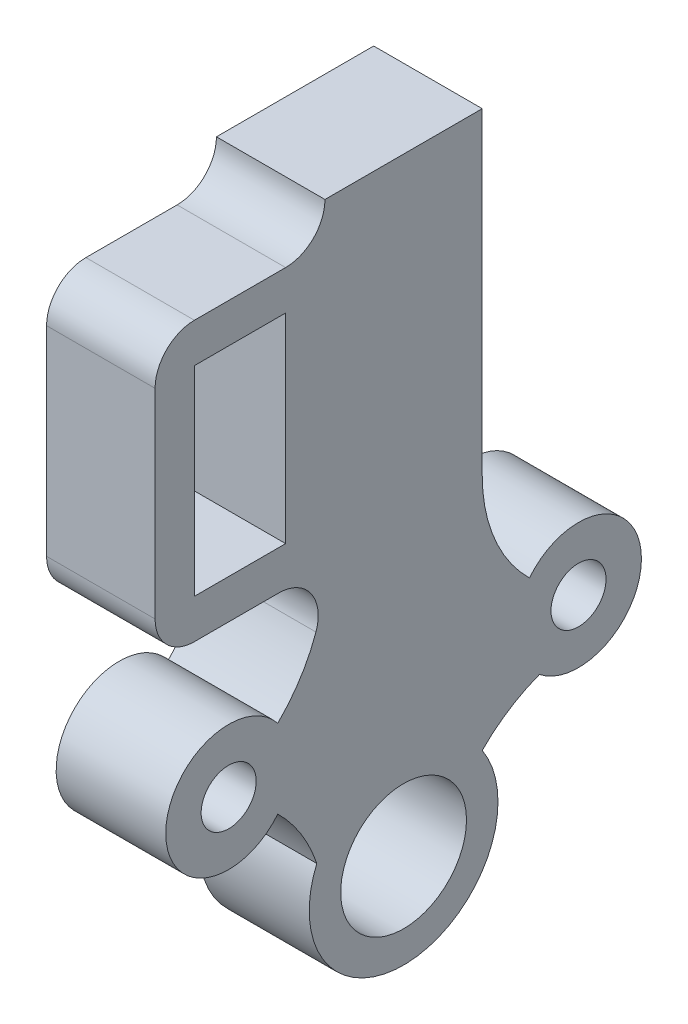
ISO-10303-21;
HEADER;
FILE_DESCRIPTION(('STEP AP214'),'2;1');
FILE_NAME('part.step','',(''),(''),'','','');
FILE_SCHEMA(('AUTOMOTIVE_DESIGN { 1 0 10303 214 1 1 1 1 }'));
ENDSEC;
DATA;
#1=APPLICATION_CONTEXT('core data for automotive mechanical design processes');
#2=APPLICATION_PROTOCOL_DEFINITION('international standard','automotive_design',2000,#1);
#3=PRODUCT_CONTEXT('',#1,'mechanical');
#4=PRODUCT('Part','Part','',(#3));
#5=PRODUCT_RELATED_PRODUCT_CATEGORY('part','',(#4));
#6=PRODUCT_DEFINITION_FORMATION('','',#4);
#7=PRODUCT_DEFINITION_CONTEXT('part definition',#1,'design');
#8=PRODUCT_DEFINITION('design','',#6,#7);
#9=PRODUCT_DEFINITION_SHAPE('','',#8);
#10=(LENGTH_UNIT() NAMED_UNIT(*) SI_UNIT(.MILLI.,.METRE.));
#11=(NAMED_UNIT(*) PLANE_ANGLE_UNIT() SI_UNIT($,.RADIAN.));
#12=(NAMED_UNIT(*) SI_UNIT($,.STERADIAN.) SOLID_ANGLE_UNIT());
#13=UNCERTAINTY_MEASURE_WITH_UNIT(LENGTH_MEASURE(1.E-05),#10,'distance_accuracy_value','');
#14=(GEOMETRIC_REPRESENTATION_CONTEXT(3) GLOBAL_UNCERTAINTY_ASSIGNED_CONTEXT((#13)) GLOBAL_UNIT_ASSIGNED_CONTEXT((#10,
#11,#12)) REPRESENTATION_CONTEXT('',''));
#15=CARTESIAN_POINT('',(0.,0.,0.));
#16=DIRECTION('',(0.,0.,1.));
#17=DIRECTION('',(1.,0.,0.));
#18=AXIS2_PLACEMENT_3D('',#15,#16,#17);
#19=CARTESIAN_POINT('',(80.,-40.,5.));
#20=DIRECTION('',(-1.,0.,0.));
#21=DIRECTION('',(0.,0.,1.));
#22=AXIS2_PLACEMENT_3D('',#19,#20,#21);
#23=PLANE('',#22);
#24=DIRECTION('',(0.,1.,0.));
#25=VECTOR('',#24,1.);
#26=CARTESIAN_POINT('',(80.,-40.,-5.));
#27=LINE('',#26,#25);
#28=CARTESIAN_POINT('',(80.,-27.8585715714571,-5.));
#29=VERTEX_POINT('',#28);
#30=CARTESIAN_POINT('',(80.,-7.65857157145712,-5.));
#31=VERTEX_POINT('',#30);
#32=EDGE_CURVE('E508',#29,#31,#27,.T.);
#33=ORIENTED_EDGE('',*,*,#32,.T.);
#34=DIRECTION('',(0.,0.,1.));
#35=VECTOR('',#34,1.);
#36=CARTESIAN_POINT('',(80.,-7.65857157145712,5.));
#37=LINE('',#36,#35);
#38=CARTESIAN_POINT('',(80.,-7.65857157145712,5.));
#39=VERTEX_POINT('',#38);
#40=EDGE_CURVE('E396',#31,#39,#37,.T.);
#41=ORIENTED_EDGE('',*,*,#40,.T.);
#42=CARTESIAN_POINT('',(80.,-7.65857157145712,7.5));
#43=DIRECTION('',(-1.,0.,0.));
#44=DIRECTION('',(0.,0.,1.));
#45=AXIS2_PLACEMENT_3D('',#42,#43,#44);
#46=CIRCLE('',#45,2.5);
#47=CARTESIAN_POINT('',(80.,-10.1585715714571,7.5));
#48=VERTEX_POINT('',#47);
#49=EDGE_CURVE('E551',#39,#48,#46,.T.);
#50=ORIENTED_EDGE('',*,*,#49,.T.);
#51=DIRECTION('',(0.,0.,-1.));
#52=VECTOR('',#51,1.);
#53=CARTESIAN_POINT('',(80.,-10.1585715714571,5.));
#54=LINE('',#53,#52);
#55=CARTESIAN_POINT('',(80.,-10.1585715714571,13.3));
#56=VERTEX_POINT('',#55);
#57=EDGE_CURVE('E458',#56,#48,#54,.T.);
#58=ORIENTED_EDGE('',*,*,#57,.F.);
#59=CARTESIAN_POINT('',(80.,-12.6585715714571,13.3));
#60=DIRECTION('',(-1.,0.,0.));
#61=DIRECTION('',(0.,0.,1.));
#62=AXIS2_PLACEMENT_3D('',#59,#60,#61);
#63=CIRCLE('',#62,2.5);
#64=CARTESIAN_POINT('',(80.,-12.6585715714571,15.8));
#65=VERTEX_POINT('',#64);
#66=EDGE_CURVE('E532',#56,#65,#63,.F.);
#67=ORIENTED_EDGE('',*,*,#66,.T.);
#68=DIRECTION('',(0.,1.,0.));
#69=VECTOR('',#68,1.);
#70=CARTESIAN_POINT('',(80.,-27.8585715714571,15.8));
#71=LINE('',#70,#69);
#72=CARTESIAN_POINT('',(80.,-25.3585715714571,15.8));
#73=VERTEX_POINT('',#72);
#74=EDGE_CURVE('E479',#73,#65,#71,.T.);
#75=ORIENTED_EDGE('',*,*,#74,.F.);
#76=CARTESIAN_POINT('',(80.,-25.3585715714571,13.3));
#77=DIRECTION('',(-1.,0.,0.));
#78=DIRECTION('',(0.,0.,1.));
#79=AXIS2_PLACEMENT_3D('',#76,#77,#78);
#80=CIRCLE('',#79,2.5);
#81=CARTESIAN_POINT('',(80.,-27.8585715714571,13.3));
#82=VERTEX_POINT('',#81);
#83=EDGE_CURVE('E534',#73,#82,#80,.F.);
#84=ORIENTED_EDGE('',*,*,#83,.T.);
#85=DIRECTION('',(0.,0.,1.));
#86=VECTOR('',#85,1.);
#87=CARTESIAN_POINT('',(80.,-27.8585715714572,5.));
#88=LINE('',#87,#86);
#89=CARTESIAN_POINT('',(80.,-27.8585715714572,7.92893218813453));
#90=VERTEX_POINT('',#89);
#91=EDGE_CURVE('E468',#90,#82,#88,.T.);
#92=ORIENTED_EDGE('',*,*,#91,.F.);
#93=CARTESIAN_POINT('',(80.,-30.3585715714572,7.92893218813454));
#94=DIRECTION('',(-1.,0.,0.));
#95=DIRECTION('',(0.,0.,1.));
#96=AXIS2_PLACEMENT_3D('',#93,#94,#95);
#97=CIRCLE('',#96,2.5);
#98=CARTESIAN_POINT('',(80.,-31.1919049047905,5.57190958417939));
#99=VERTEX_POINT('',#98);
#100=EDGE_CURVE('E256',#90,#99,#97,.T.);
#101=ORIENTED_EDGE('',*,*,#100,.T.);
#102=CARTESIAN_POINT('',(80.,-27.8585715714571,15.));
#103=DIRECTION('',(-1.,0.,0.));
#104=DIRECTION('',(0.,0.,1.));
#105=AXIS2_PLACEMENT_3D('',#102,#103,#104);
#106=CIRCLE('',#105,10.);
#107=CARTESIAN_POINT('',(80.,-35.,8.));
#108=VERTEX_POINT('',#107);
#109=EDGE_CURVE('E525',#99,#108,#106,.T.);
#110=ORIENTED_EDGE('',*,*,#109,.T.);
#111=CARTESIAN_POINT('',(80.,-37.5,11.1224989991992));
#112=DIRECTION('',(1.,0.,0.));
#113=DIRECTION('',(0.,0.,-1.));
#114=AXIS2_PLACEMENT_3D('',#111,#112,#113);
#115=CIRCLE('',#114,4.);
#116=CARTESIAN_POINT('',(80.,-40.,8.));
#117=VERTEX_POINT('',#116);
#118=EDGE_CURVE('E497',#108,#117,#115,.T.);
#119=ORIENTED_EDGE('',*,*,#118,.T.);
#120=CARTESIAN_POINT('',(80.,-47.1414284285428,15.));
#121=DIRECTION('',(-1.,0.,0.));
#122=DIRECTION('',(0.,0.,1.));
#123=AXIS2_PLACEMENT_3D('',#120,#121,#122);
#124=CIRCLE('',#123,10.);
#125=CARTESIAN_POINT('',(80.,-43.9616539221158,5.51901724037657));
#126=VERTEX_POINT('',#125);
#127=EDGE_CURVE('E523',#117,#126,#124,.T.);
#128=ORIENTED_EDGE('',*,*,#127,.T.);
#129=CARTESIAN_POINT('',(80.,-46.3194527774856,0.));
#130=DIRECTION('',(1.,0.,0.));
#131=DIRECTION('',(0.,0.,-1.));
#132=AXIS2_PLACEMENT_3D('',#129,#130,#131);
#133=CIRCLE('',#132,6.00156369140217);
#134=CARTESIAN_POINT('',(80.,-43.,-5.));
#135=VERTEX_POINT('',#134);
#136=EDGE_CURVE('E494',#126,#135,#133,.T.);
#137=ORIENTED_EDGE('',*,*,#136,.T.);
#138=CARTESIAN_POINT('',(80.,-50.,-12.1414284285429));
#139=DIRECTION('',(-1.,0.,0.));
#140=DIRECTION('',(0.,0.,1.));
#141=AXIS2_PLACEMENT_3D('',#138,#139,#140);
#142=CIRCLE('',#141,10.);
#143=CARTESIAN_POINT('',(80.,-40.6341252172928,-8.63708975275117));
#144=VERTEX_POINT('',#143);
#145=EDGE_CURVE('E521',#135,#144,#142,.T.);
#146=ORIENTED_EDGE('',*,*,#145,.T.);
#147=CARTESIAN_POINT('',(80.,-37.5,-11.1224989991992));
#148=DIRECTION('',(-1.,0.,0.));
#149=DIRECTION('',(0.,0.,1.));
#150=AXIS2_PLACEMENT_3D('',#147,#148,#149);
#151=CIRCLE('',#150,4.);
#152=CARTESIAN_POINT('',(80.,-35.,-8.));
#153=VERTEX_POINT('',#152);
#154=EDGE_CURVE('E491',#153,#144,#151,.T.);
#155=ORIENTED_EDGE('',*,*,#154,.F.);
#156=CARTESIAN_POINT('',(80.,-27.8585715714571,-15.));
#157=DIRECTION('',(-1.,0.,0.));
#158=DIRECTION('',(0.,0.,1.));
#159=AXIS2_PLACEMENT_3D('',#156,#157,#158);
#160=CIRCLE('',#159,10.);
#161=EDGE_CURVE('E519',#153,#29,#160,.T.);
#162=ORIENTED_EDGE('',*,*,#161,.T.);
#163=EDGE_LOOP('',(#33,#41,#50,#58,#67,#75,#84,#92,#101,#110,#119,#128,#137,#146,#155,#162));
#164=FACE_BOUND('',#163,.T.);
#165=CARTESIAN_POINT('',(80.,-37.5,-11.1224989991992));
#166=DIRECTION('',(-1.,0.,0.));
#167=DIRECTION('',(0.,0.,1.));
#168=AXIS2_PLACEMENT_3D('',#165,#166,#167);
#169=CIRCLE('',#168,1.75);
#170=CARTESIAN_POINT('',(80.,-37.5,-9.3724989991992));
#171=VERTEX_POINT('',#170);
#172=EDGE_CURVE('E476',#171,#171,#169,.T.);
#173=ORIENTED_EDGE('',*,*,#172,.T.);
#174=EDGE_LOOP('',(#173));
#175=FACE_BOUND('',#174,.T.);
#176=CARTESIAN_POINT('',(80.,-37.5,11.1224989991992));
#177=DIRECTION('',(1.,0.,0.));
#178=DIRECTION('',(0.,0.,-1.));
#179=AXIS2_PLACEMENT_3D('',#176,#177,#178);
#180=CIRCLE('',#179,1.75);
#181=CARTESIAN_POINT('',(80.,-37.5,9.3724989991992));
#182=VERTEX_POINT('',#181);
#183=EDGE_CURVE('E488',#182,#182,#180,.T.);
#184=ORIENTED_EDGE('',*,*,#183,.F.);
#185=EDGE_LOOP('',(#184));
#186=FACE_BOUND('',#185,.T.);
#187=CARTESIAN_POINT('',(80.,-46.3194527774856,0.));
#188=DIRECTION('',(1.,0.,0.));
#189=DIRECTION('',(0.,0.,-1.));
#190=AXIS2_PLACEMENT_3D('',#187,#188,#189);
#191=CIRCLE('',#190,4.);
#192=CARTESIAN_POINT('',(80.,-46.3194527774856,-4.));
#193=VERTEX_POINT('',#192);
#194=EDGE_CURVE('E485',#193,#193,#191,.T.);
#195=ORIENTED_EDGE('',*,*,#194,.F.);
#196=EDGE_LOOP('',(#195));
#197=FACE_BOUND('',#196,.T.);
#198=DIRECTION('',(0.,-1.,0.));
#199=VECTOR('',#198,1.);
#200=CARTESIAN_POINT('',(80.,-12.6585715714571,7.5));
#201=LINE('',#200,#199);
#202=CARTESIAN_POINT('',(80.,-12.6585715714571,7.5));
#203=VERTEX_POINT('',#202);
#204=CARTESIAN_POINT('',(80.,-25.3585715714571,7.5));
#205=VERTEX_POINT('',#204);
#206=EDGE_CURVE('E401',#203,#205,#201,.T.);
#207=ORIENTED_EDGE('',*,*,#206,.T.);
#208=DIRECTION('',(0.,0.,1.));
#209=VECTOR('',#208,1.);
#210=CARTESIAN_POINT('',(80.,-25.3585715714571,7.5));
#211=LINE('',#210,#209);
#212=CARTESIAN_POINT('',(80.,-25.3585715714571,13.3));
#213=VERTEX_POINT('',#212);
#214=EDGE_CURVE('E437',#205,#213,#211,.T.);
#215=ORIENTED_EDGE('',*,*,#214,.T.);
#216=DIRECTION('',(0.,1.,0.));
#217=VECTOR('',#216,1.);
#218=CARTESIAN_POINT('',(80.,-12.6585715714571,13.3));
#219=LINE('',#218,#217);
#220=CARTESIAN_POINT('',(80.,-12.6585715714571,13.3));
#221=VERTEX_POINT('',#220);
#222=EDGE_CURVE('E450',#213,#221,#219,.T.);
#223=ORIENTED_EDGE('',*,*,#222,.T.);
#224=DIRECTION('',(0.,0.,-1.));
#225=VECTOR('',#224,1.);
#226=CARTESIAN_POINT('',(80.,-12.6585715714571,7.5));
#227=LINE('',#226,#225);
#228=EDGE_CURVE('E447',#221,#203,#227,.T.);
#229=ORIENTED_EDGE('',*,*,#228,.T.);
#230=EDGE_LOOP('',(#207,#215,#223,#229));
#231=FACE_BOUND('',#230,.T.);
#232=ADVANCED_FACE('F248',(#164,#175,#186,#197,#231),#23,.F.);
#233=CARTESIAN_POINT('',(0.,0.,5.));
#234=DIRECTION('',(0.,0.,1.));
#235=DIRECTION('',(1.,0.,0.));
#236=AXIS2_PLACEMENT_3D('',#233,#234,#235);
#237=PLANE('',#236);
#238=DIRECTION('',(0.00231001959994547,0.999997331901165,0.));
#239=VECTOR('',#238,1.);
#240=CARTESIAN_POINT('',(73.1173013277058,-0.168902849811616,5.));
#241=LINE('',#240,#239);
#242=CARTESIAN_POINT('',(73.0533374795809,-27.8585715714571,5.));
#243=VERTEX_POINT('',#242);
#244=CARTESIAN_POINT('',(73.1,-7.65857157145712,5.));
#245=VERTEX_POINT('',#244);
#246=EDGE_CURVE('E410',#243,#245,#241,.T.);
#247=ORIENTED_EDGE('',*,*,#246,.F.);
#248=DIRECTION('',(-1.,0.,0.));
#249=VECTOR('',#248,1.);
#250=CARTESIAN_POINT('',(80.,-27.8585715714571,5.));
#251=LINE('',#250,#249);
#252=CARTESIAN_POINT('',(73.1,-27.8585715714571,5.));
#253=VERTEX_POINT('',#252);
#254=EDGE_CURVE('E517',#243,#253,#251,.F.);
#255=ORIENTED_EDGE('',*,*,#254,.T.);
#256=DIRECTION('',(0.,-1.,0.));
#257=VECTOR('',#256,1.);
#258=CARTESIAN_POINT('',(73.1,-27.8585715714572,5.));
#259=LINE('',#258,#257);
#260=EDGE_CURVE('E465',#245,#253,#259,.T.);
#261=ORIENTED_EDGE('',*,*,#260,.F.);
#262=EDGE_LOOP('',(#247,#255,#261));
#263=FACE_BOUND('',#262,.T.);
#264=ADVANCED_FACE('F598',(#263),#237,.T.);
#265=CARTESIAN_POINT('',(0.,0.,-5.));
#266=DIRECTION('',(0.,0.,1.));
#267=DIRECTION('',(1.,0.,0.));
#268=AXIS2_PLACEMENT_3D('',#265,#266,#267);
#269=PLANE('',#268);
#270=DIRECTION('',(0.00231001959994547,0.999997331901165,0.));
#271=VECTOR('',#270,1.);
#272=CARTESIAN_POINT('',(73.1173013277058,-0.168902849811616,-5.));
#273=LINE('',#272,#271);
#274=CARTESIAN_POINT('',(73.0533374795809,-27.8585715714571,-5.));
#275=VERTEX_POINT('',#274);
#276=CARTESIAN_POINT('',(73.1,-7.65857157145712,-5.));
#277=VERTEX_POINT('',#276);
#278=EDGE_CURVE('E407',#275,#277,#273,.T.);
#279=ORIENTED_EDGE('',*,*,#278,.T.);
#280=DIRECTION('',(1.,0.,0.));
#281=VECTOR('',#280,1.);
#282=CARTESIAN_POINT('',(0.,-7.65857157145712,-5.));
#283=LINE('',#282,#281);
#284=EDGE_CURVE('E390',#277,#31,#283,.T.);
#285=ORIENTED_EDGE('',*,*,#284,.T.);
#286=ORIENTED_EDGE('',*,*,#32,.F.);
#287=DIRECTION('',(1.,0.,0.));
#288=VECTOR('',#287,1.);
#289=CARTESIAN_POINT('',(0.,-27.8585715714571,-5.));
#290=LINE('',#289,#288);
#291=EDGE_CURVE('E417',#29,#275,#290,.F.);
#292=ORIENTED_EDGE('',*,*,#291,.T.);
#293=EDGE_LOOP('',(#279,#285,#286,#292));
#294=FACE_BOUND('',#293,.T.);
#295=ADVANCED_FACE('F415',(#294),#269,.F.);
#296=CARTESIAN_POINT('',(60.,-37.5,-11.1224989991992));
#297=DIRECTION('',(1.,0.,0.));
#298=DIRECTION('',(0.,0.,-1.));
#299=AXIS2_PLACEMENT_3D('',#296,#297,#298);
#300=CYLINDRICAL_SURFACE('',#299,4.);
#301=CARTESIAN_POINT('',(73.0310655315158,-37.5,-11.1224989991992));
#302=DIRECTION('',(0.999997331901164,-0.00231001959994547,0.));
#303=DIRECTION('',(0.00231001959994547,0.999997331901165,0.));
#304=AXIS2_PLACEMENT_3D('',#301,#302,#303);
#305=ELLIPSE('',#304,4.00001067242382,4.);
#306=CARTESIAN_POINT('',(73.0238256215183,-40.6341252172928,-8.63708975275117));
#307=VERTEX_POINT('',#306);
#308=CARTESIAN_POINT('',(73.0368405959241,-35.,-8.));
#309=VERTEX_POINT('',#308);
#310=EDGE_CURVE('E424',#307,#309,#305,.T.);
#311=ORIENTED_EDGE('',*,*,#310,.T.);
#312=DIRECTION('',(1.,0.,0.));
#313=VECTOR('',#312,1.);
#314=CARTESIAN_POINT('',(60.,-35.,-8.));
#315=LINE('',#314,#313);
#316=EDGE_CURVE('E506',#309,#153,#315,.T.);
#317=ORIENTED_EDGE('',*,*,#316,.T.);
#318=ORIENTED_EDGE('',*,*,#154,.T.);
#319=DIRECTION('',(1.,0.,0.));
#320=VECTOR('',#319,1.);
#321=CARTESIAN_POINT('',(70.,-40.6341252172928,-8.63708975275117));
#322=LINE('',#321,#320);
#323=EDGE_CURVE('E511',#144,#307,#322,.F.);
#324=ORIENTED_EDGE('',*,*,#323,.T.);
#325=EDGE_LOOP('',(#311,#317,#318,#324));
#326=FACE_BOUND('',#325,.T.);
#327=ADVANCED_FACE('F630',(#326),#300,.T.);
#328=CARTESIAN_POINT('',(60.,-46.3194527774856,0.));
#329=DIRECTION('',(1.,0.,0.));
#330=DIRECTION('',(0.,0.,-1.));
#331=AXIS2_PLACEMENT_3D('',#328,#329,#330);
#332=CYLINDRICAL_SURFACE('',#331,6.00156369140217);
#333=CARTESIAN_POINT('',(73.0106923683813,-46.3194527774856,0.));
#334=DIRECTION('',(0.999997331901164,-0.00231001959994547,0.));
#335=DIRECTION('',(0.00231001959994547,0.999997331901165,0.));
#336=AXIS2_PLACEMENT_3D('',#333,#334,#335);
#337=ELLIPSE('',#336,6.00157970420999,6.00156369140217);
#338=CARTESIAN_POINT('',(73.0183603898175,-43.,-5.));
#339=VERTEX_POINT('',#338);
#340=CARTESIAN_POINT('',(73.016138944482,-43.9616539221158,5.51901724037657));
#341=VERTEX_POINT('',#340);
#342=EDGE_CURVE('E621',#339,#341,#337,.F.);
#343=ORIENTED_EDGE('',*,*,#342,.F.);
#344=DIRECTION('',(1.,0.,0.));
#345=VECTOR('',#344,1.);
#346=CARTESIAN_POINT('',(60.,-43.,-5.));
#347=LINE('',#346,#345);
#348=EDGE_CURVE('E504',#339,#135,#347,.T.);
#349=ORIENTED_EDGE('',*,*,#348,.T.);
#350=ORIENTED_EDGE('',*,*,#136,.F.);
#351=DIRECTION('',(1.,0.,0.));
#352=VECTOR('',#351,1.);
#353=CARTESIAN_POINT('',(70.,-43.9616539221158,5.51901724037657));
#354=LINE('',#353,#352);
#355=EDGE_CURVE('E514',#126,#341,#354,.F.);
#356=ORIENTED_EDGE('',*,*,#355,.T.);
#357=EDGE_LOOP('',(#343,#349,#350,#356));
#358=FACE_BOUND('',#357,.T.);
#359=ADVANCED_FACE('F615',(#358),#332,.T.);
#360=CARTESIAN_POINT('',(60.,-37.5,11.1224989991992));
#361=DIRECTION('',(1.,0.,0.));
#362=DIRECTION('',(0.,0.,-1.));
#363=AXIS2_PLACEMENT_3D('',#360,#361,#362);
#364=CYLINDRICAL_SURFACE('',#363,4.);
#365=CARTESIAN_POINT('',(73.0310655315158,-37.5,11.1224989991992));
#366=DIRECTION('',(0.999997331901164,-0.00231001959994547,0.));
#367=DIRECTION('',(0.00231001959994547,0.999997331901165,0.));
#368=AXIS2_PLACEMENT_3D('',#365,#366,#367);
#369=ELLIPSE('',#368,4.00001067242382,4.);
#370=CARTESIAN_POINT('',(73.0252904671074,-40.,8.));
#371=VERTEX_POINT('',#370);
#372=CARTESIAN_POINT('',(73.036840595924,-35.,8.));
#373=VERTEX_POINT('',#372);
#374=EDGE_CURVE('E601',#371,#373,#369,.F.);
#375=ORIENTED_EDGE('',*,*,#374,.F.);
#376=DIRECTION('',(1.,0.,0.));
#377=VECTOR('',#376,1.);
#378=CARTESIAN_POINT('',(60.,-40.,8.));
#379=LINE('',#378,#377);
#380=EDGE_CURVE('E502',#371,#117,#379,.T.);
#381=ORIENTED_EDGE('',*,*,#380,.T.);
#382=ORIENTED_EDGE('',*,*,#118,.F.);
#383=DIRECTION('',(1.,0.,0.));
#384=VECTOR('',#383,1.);
#385=CARTESIAN_POINT('',(60.,-35.,8.));
#386=LINE('',#385,#384);
#387=EDGE_CURVE('E500',#373,#108,#386,.T.);
#388=ORIENTED_EDGE('',*,*,#387,.F.);
#389=EDGE_LOOP('',(#375,#381,#382,#388));
#390=FACE_BOUND('',#389,.T.);
#391=ADVANCED_FACE('F606',(#390),#364,.T.);
#392=CARTESIAN_POINT('',(60.,-37.5,11.1224989991992));
#393=DIRECTION('',(1.,0.,0.));
#394=DIRECTION('',(0.,0.,-1.));
#395=AXIS2_PLACEMENT_3D('',#392,#393,#394);
#396=CYLINDRICAL_SURFACE('',#395,1.75);
#397=CARTESIAN_POINT('',(73.0310655315158,-37.5,11.1224989991992));
#398=DIRECTION('',(0.999997331901164,-0.00231001959994547,0.));
#399=DIRECTION('',(0.00231001959994547,0.999997331901165,0.));
#400=AXIS2_PLACEMENT_3D('',#397,#398,#399);
#401=ELLIPSE('',#400,1.75000466918542,1.75);
#402=CARTESIAN_POINT('',(73.0351080766016,-35.75,11.1224989991992));
#403=VERTEX_POINT('',#402);
#404=EDGE_CURVE('E430',#403,#403,#401,.F.);
#405=ORIENTED_EDGE('',*,*,#404,.T.);
#406=EDGE_LOOP('',(#405));
#407=FACE_BOUND('',#406,.T.);
#408=ORIENTED_EDGE('',*,*,#183,.T.);
#409=EDGE_LOOP('',(#408));
#410=FACE_BOUND('',#409,.T.);
#411=ADVANCED_FACE('F664',(#407,#410),#396,.F.);
#412=CARTESIAN_POINT('',(60.,-46.3194527774856,0.));
#413=DIRECTION('',(1.,0.,0.));
#414=DIRECTION('',(0.,0.,-1.));
#415=AXIS2_PLACEMENT_3D('',#412,#413,#414);
#416=CYLINDRICAL_SURFACE('',#415,4.);
#417=CARTESIAN_POINT('',(73.0106923683813,-46.3194527774856,0.));
#418=DIRECTION('',(0.999997331901164,-0.00231001959994547,0.));
#419=DIRECTION('',(0.00231001959994547,0.999997331901165,0.));
#420=AXIS2_PLACEMENT_3D('',#417,#418,#419);
#421=ELLIPSE('',#420,4.00001067242382,4.);
#422=CARTESIAN_POINT('',(73.0199324714346,-42.3194527774856,0.));
#423=VERTEX_POINT('',#422);
#424=EDGE_CURVE('E422',#423,#423,#421,.F.);
#425=ORIENTED_EDGE('',*,*,#424,.T.);
#426=EDGE_LOOP('',(#425));
#427=FACE_BOUND('',#426,.T.);
#428=ORIENTED_EDGE('',*,*,#194,.T.);
#429=EDGE_LOOP('',(#428));
#430=FACE_BOUND('',#429,.T.);
#431=ADVANCED_FACE('F667',(#427,#430),#416,.F.);
#432=CARTESIAN_POINT('',(60.,-37.5,-11.1224989991992));
#433=DIRECTION('',(1.,0.,0.));
#434=DIRECTION('',(0.,0.,-1.));
#435=AXIS2_PLACEMENT_3D('',#432,#433,#434);
#436=CYLINDRICAL_SURFACE('',#435,1.75);
#437=CARTESIAN_POINT('',(73.0310655315158,-37.5,-11.1224989991992));
#438=DIRECTION('',(0.999997331901164,-0.00231001959994547,0.));
#439=DIRECTION('',(0.00231001959994547,0.999997331901165,0.));
#440=AXIS2_PLACEMENT_3D('',#437,#438,#439);
#441=ELLIPSE('',#440,1.75000466918542,1.75);
#442=CARTESIAN_POINT('',(73.0351080766016,-35.75,-11.1224989991992));
#443=VERTEX_POINT('',#442);
#444=EDGE_CURVE('E418',#443,#443,#441,.T.);
#445=ORIENTED_EDGE('',*,*,#444,.F.);
#446=EDGE_LOOP('',(#445));
#447=FACE_BOUND('',#446,.T.);
#448=ORIENTED_EDGE('',*,*,#172,.F.);
#449=EDGE_LOOP('',(#448));
#450=FACE_BOUND('',#449,.T.);
#451=ADVANCED_FACE('F646',(#447,#450),#436,.F.);
#452=CARTESIAN_POINT('',(60.,-27.8585715714571,-15.));
#453=DIRECTION('',(1.,0.,0.));
#454=DIRECTION('',(0.,0.,-1.));
#455=AXIS2_PLACEMENT_3D('',#452,#453,#454);
#456=CYLINDRICAL_SURFACE('',#455,10.);
#457=ORIENTED_EDGE('',*,*,#316,.F.);
#458=CARTESIAN_POINT('',(73.0533374795809,-27.8585715714571,-15.));
#459=DIRECTION('',(0.999997331901164,-0.00231001959994547,0.));
#460=DIRECTION('',(0.00231001959994547,0.999997331901165,0.));
#461=AXIS2_PLACEMENT_3D('',#458,#459,#460);
#462=ELLIPSE('',#461,10.0000266810595,10.);
#463=EDGE_CURVE('E419',#309,#275,#462,.F.);
#464=ORIENTED_EDGE('',*,*,#463,.T.);
#465=ORIENTED_EDGE('',*,*,#291,.F.);
#466=ORIENTED_EDGE('',*,*,#161,.F.);
#467=EDGE_LOOP('',(#457,#464,#465,#466));
#468=FACE_BOUND('',#467,.T.);
#469=ADVANCED_FACE('F636',(#468),#456,.F.);
#470=CARTESIAN_POINT('',(60.,-50.,-12.1414284285429));
#471=DIRECTION('',(1.,0.,0.));
#472=DIRECTION('',(0.,0.,-1.));
#473=AXIS2_PLACEMENT_3D('',#470,#471,#472);
#474=CYLINDRICAL_SURFACE('',#473,10.);
#475=ORIENTED_EDGE('',*,*,#348,.F.);
#476=CARTESIAN_POINT('',(73.0021902094742,-50.,-12.1414284285429));
#477=DIRECTION('',(0.999997331901164,-0.00231001959994547,0.));
#478=DIRECTION('',(0.00231001959994547,0.999997331901165,0.));
#479=AXIS2_PLACEMENT_3D('',#476,#477,#478);
#480=ELLIPSE('',#479,10.0000266810595,10.);
#481=EDGE_CURVE('E623',#339,#307,#480,.F.);
#482=ORIENTED_EDGE('',*,*,#481,.T.);
#483=ORIENTED_EDGE('',*,*,#323,.F.);
#484=ORIENTED_EDGE('',*,*,#145,.F.);
#485=EDGE_LOOP('',(#475,#482,#483,#484));
#486=FACE_BOUND('',#485,.T.);
#487=ADVANCED_FACE('F638',(#486),#474,.F.);
#488=CARTESIAN_POINT('',(60.,-47.1414284285428,15.));
#489=DIRECTION('',(1.,0.,0.));
#490=DIRECTION('',(0.,0.,-1.));
#491=AXIS2_PLACEMENT_3D('',#488,#489,#490);
#492=CYLINDRICAL_SURFACE('',#491,10.);
#493=ORIENTED_EDGE('',*,*,#380,.F.);
#494=CARTESIAN_POINT('',(73.0087935834506,-47.1414284285428,15.));
#495=DIRECTION('',(0.999997331901164,-0.00231001959994547,0.));
#496=DIRECTION('',(0.00231001959994547,0.999997331901165,0.));
#497=AXIS2_PLACEMENT_3D('',#494,#495,#496);
#498=ELLIPSE('',#497,10.0000266810595,10.);
#499=EDGE_CURVE('E620',#371,#341,#498,.F.);
#500=ORIENTED_EDGE('',*,*,#499,.T.);
#501=ORIENTED_EDGE('',*,*,#355,.F.);
#502=ORIENTED_EDGE('',*,*,#127,.F.);
#503=EDGE_LOOP('',(#493,#500,#501,#502));
#504=FACE_BOUND('',#503,.T.);
#505=ADVANCED_FACE('F619',(#504),#492,.F.);
#506=CARTESIAN_POINT('',(60.,-27.8585715714571,15.));
#507=DIRECTION('',(1.,0.,0.));
#508=DIRECTION('',(0.,0.,-1.));
#509=AXIS2_PLACEMENT_3D('',#506,#507,#508);
#510=CYLINDRICAL_SURFACE('',#509,10.);
#511=ORIENTED_EDGE('',*,*,#254,.F.);
#512=CARTESIAN_POINT('',(73.0533374795809,-27.8585715714571,15.));
#513=DIRECTION('',(0.999997331901164,-0.00231001959994547,0.));
#514=DIRECTION('',(0.00231001959994547,0.999997331901165,0.));
#515=AXIS2_PLACEMENT_3D('',#512,#513,#514);
#516=ELLIPSE('',#515,10.0000266810595,10.);
#517=EDGE_CURVE('E412',#243,#373,#516,.F.);
#518=ORIENTED_EDGE('',*,*,#517,.T.);
#519=ORIENTED_EDGE('',*,*,#387,.T.);
#520=ORIENTED_EDGE('',*,*,#109,.F.);
#521=DIRECTION('',(1.,0.,0.));
#522=VECTOR('',#521,1.);
#523=CARTESIAN_POINT('',(60.,-31.1919049047905,5.57190958417939));
#524=LINE('',#523,#522);
#525=CARTESIAN_POINT('',(73.1,-31.1919049047905,5.57190958417939));
#526=VERTEX_POINT('',#525);
#527=EDGE_CURVE('E560',#99,#526,#524,.F.);
#528=ORIENTED_EDGE('',*,*,#527,.T.);
#529=CARTESIAN_POINT('',(73.1,-27.8585715714571,15.));
#530=DIRECTION('',(-1.,0.,0.));
#531=DIRECTION('',(0.,0.,1.));
#532=AXIS2_PLACEMENT_3D('',#529,#530,#531);
#533=CIRCLE('',#532,10.);
#534=EDGE_CURVE('E262',#526,#253,#533,.F.);
#535=ORIENTED_EDGE('',*,*,#534,.T.);
#536=EDGE_LOOP('',(#511,#518,#519,#520,#528,#535));
#537=FACE_BOUND('',#536,.T.);
#538=ADVANCED_FACE('F565',(#537),#510,.F.);
#539=CARTESIAN_POINT('',(73.1,0.,0.));
#540=DIRECTION('',(-1.,0.,0.));
#541=DIRECTION('',(0.,0.,-1.));
#542=AXIS2_PLACEMENT_3D('',#539,#540,#541);
#543=PLANE('',#542);
#544=ORIENTED_EDGE('',*,*,#260,.T.);
#545=ORIENTED_EDGE('',*,*,#534,.F.);
#546=CARTESIAN_POINT('',(73.1,-30.3585715714572,7.92893218813454));
#547=DIRECTION('',(-1.,0.,0.));
#548=DIRECTION('',(0.,0.,1.));
#549=AXIS2_PLACEMENT_3D('',#546,#547,#548);
#550=CIRCLE('',#549,2.5);
#551=CARTESIAN_POINT('',(73.1,-27.8585715714572,7.92893218813453));
#552=VERTEX_POINT('',#551);
#553=EDGE_CURVE('E12',#526,#552,#550,.F.);
#554=ORIENTED_EDGE('',*,*,#553,.T.);
#555=DIRECTION('',(0.,0.,1.));
#556=VECTOR('',#555,1.);
#557=CARTESIAN_POINT('',(73.1,-27.8585715714572,5.));
#558=LINE('',#557,#556);
#559=CARTESIAN_POINT('',(73.1,-27.8585715714571,13.3));
#560=VERTEX_POINT('',#559);
#561=EDGE_CURVE('E474',#552,#560,#558,.T.);
#562=ORIENTED_EDGE('',*,*,#561,.T.);
#563=CARTESIAN_POINT('',(73.1,-25.3585715714571,13.3));
#564=DIRECTION('',(-1.,0.,0.));
#565=DIRECTION('',(0.,0.,1.));
#566=AXIS2_PLACEMENT_3D('',#563,#564,#565);
#567=CIRCLE('',#566,2.5);
#568=CARTESIAN_POINT('',(73.1,-25.3585715714571,15.8));
#569=VERTEX_POINT('',#568);
#570=EDGE_CURVE('E542',#560,#569,#567,.T.);
#571=ORIENTED_EDGE('',*,*,#570,.T.);
#572=DIRECTION('',(0.,1.,0.));
#573=VECTOR('',#572,1.);
#574=CARTESIAN_POINT('',(73.1,-27.8585715714571,15.8));
#575=LINE('',#574,#573);
#576=CARTESIAN_POINT('',(73.1,-12.6585715714571,15.8));
#577=VERTEX_POINT('',#576);
#578=EDGE_CURVE('E471',#569,#577,#575,.T.);
#579=ORIENTED_EDGE('',*,*,#578,.T.);
#580=CARTESIAN_POINT('',(73.1,-12.6585715714571,13.3));
#581=DIRECTION('',(-1.,0.,0.));
#582=DIRECTION('',(0.,0.,1.));
#583=AXIS2_PLACEMENT_3D('',#580,#581,#582);
#584=CIRCLE('',#583,2.5);
#585=CARTESIAN_POINT('',(73.1,-10.1585715714571,13.3));
#586=VERTEX_POINT('',#585);
#587=EDGE_CURVE('E540',#577,#586,#584,.T.);
#588=ORIENTED_EDGE('',*,*,#587,.T.);
#589=DIRECTION('',(0.,0.,-1.));
#590=VECTOR('',#589,1.);
#591=CARTESIAN_POINT('',(73.1,-10.1585715714571,5.));
#592=LINE('',#591,#590);
#593=CARTESIAN_POINT('',(73.1,-10.1585715714571,7.5));
#594=VERTEX_POINT('',#593);
#595=EDGE_CURVE('E467',#586,#594,#592,.T.);
#596=ORIENTED_EDGE('',*,*,#595,.T.);
#597=CARTESIAN_POINT('',(73.1,-7.65857157145712,7.5));
#598=DIRECTION('',(-1.,0.,0.));
#599=DIRECTION('',(0.,0.,1.));
#600=AXIS2_PLACEMENT_3D('',#597,#598,#599);
#601=CIRCLE('',#600,2.5);
#602=EDGE_CURVE('E553',#594,#245,#601,.F.);
#603=ORIENTED_EDGE('',*,*,#602,.T.);
#604=EDGE_LOOP('',(#544,#545,#554,#562,#571,#579,#588,#596,#603));
#605=FACE_BOUND('',#604,.T.);
#606=DIRECTION('',(0.,0.,1.));
#607=VECTOR('',#606,1.);
#608=CARTESIAN_POINT('',(73.1,-25.3585715714571,7.5));
#609=LINE('',#608,#607);
#610=CARTESIAN_POINT('',(73.1,-25.3585715714571,7.5));
#611=VERTEX_POINT('',#610);
#612=CARTESIAN_POINT('',(73.1,-25.3585715714571,13.3));
#613=VERTEX_POINT('',#612);
#614=EDGE_CURVE('E442',#611,#613,#609,.T.);
#615=ORIENTED_EDGE('',*,*,#614,.F.);
#616=DIRECTION('',(0.,-1.,0.));
#617=VECTOR('',#616,1.);
#618=CARTESIAN_POINT('',(73.1,-12.6585715714571,7.5));
#619=LINE('',#618,#617);
#620=CARTESIAN_POINT('',(73.1,-12.6585715714571,7.5));
#621=VERTEX_POINT('',#620);
#622=EDGE_CURVE('E434',#621,#611,#619,.T.);
#623=ORIENTED_EDGE('',*,*,#622,.F.);
#624=DIRECTION('',(0.,0.,-1.));
#625=VECTOR('',#624,1.);
#626=CARTESIAN_POINT('',(73.1,-12.6585715714571,7.5));
#627=LINE('',#626,#625);
#628=CARTESIAN_POINT('',(73.1,-12.6585715714571,13.3));
#629=VERTEX_POINT('',#628);
#630=EDGE_CURVE('E436',#629,#621,#627,.T.);
#631=ORIENTED_EDGE('',*,*,#630,.F.);
#632=DIRECTION('',(0.,1.,0.));
#633=VECTOR('',#632,1.);
#634=CARTESIAN_POINT('',(73.1,-12.6585715714571,13.3));
#635=LINE('',#634,#633);
#636=EDGE_CURVE('E439',#613,#629,#635,.T.);
#637=ORIENTED_EDGE('',*,*,#636,.F.);
#638=EDGE_LOOP('',(#615,#623,#631,#637));
#639=FACE_BOUND('',#638,.T.);
#640=ADVANCED_FACE('F569',(#605,#639),#543,.T.);
#641=CARTESIAN_POINT('',(73.1,-27.8585715714572,5.));
#642=DIRECTION('',(0.,1.,0.));
#643=DIRECTION('',(0.,0.,1.));
#644=AXIS2_PLACEMENT_3D('',#641,#642,#643);
#645=PLANE('',#644);
#646=ORIENTED_EDGE('',*,*,#561,.F.);
#647=DIRECTION('',(-1.,0.,0.));
#648=VECTOR('',#647,1.);
#649=CARTESIAN_POINT('',(80.,-27.8585715714572,7.92893218813453));
#650=LINE('',#649,#648);
#651=EDGE_CURVE('E556',#552,#90,#650,.F.);
#652=ORIENTED_EDGE('',*,*,#651,.T.);
#653=ORIENTED_EDGE('',*,*,#91,.T.);
#654=DIRECTION('',(1.,0.,0.));
#655=VECTOR('',#654,1.);
#656=CARTESIAN_POINT('',(73.1,-27.8585715714571,13.3));
#657=LINE('',#656,#655);
#658=EDGE_CURVE('E537',#82,#560,#657,.F.);
#659=ORIENTED_EDGE('',*,*,#658,.T.);
#660=EDGE_LOOP('',(#646,#652,#653,#659));
#661=FACE_BOUND('',#660,.T.);
#662=ADVANCED_FACE('F572',(#661),#645,.F.);
#663=CARTESIAN_POINT('',(73.1,-27.8585715714571,15.8));
#664=DIRECTION('',(0.,0.,-1.));
#665=DIRECTION('',(-1.,0.,0.));
#666=AXIS2_PLACEMENT_3D('',#663,#664,#665);
#667=PLANE('',#666);
#668=ORIENTED_EDGE('',*,*,#578,.F.);
#669=DIRECTION('',(1.,0.,0.));
#670=VECTOR('',#669,1.);
#671=CARTESIAN_POINT('',(73.1,-25.3585715714571,15.8));
#672=LINE('',#671,#670);
#673=EDGE_CURVE('E529',#569,#73,#672,.T.);
#674=ORIENTED_EDGE('',*,*,#673,.T.);
#675=ORIENTED_EDGE('',*,*,#74,.T.);
#676=DIRECTION('',(1.,0.,0.));
#677=VECTOR('',#676,1.);
#678=CARTESIAN_POINT('',(73.1,-12.6585715714571,15.8));
#679=LINE('',#678,#677);
#680=EDGE_CURVE('E527',#65,#577,#679,.F.);
#681=ORIENTED_EDGE('',*,*,#680,.T.);
#682=EDGE_LOOP('',(#668,#674,#675,#681));
#683=FACE_BOUND('',#682,.T.);
#684=ADVANCED_FACE('F581',(#683),#667,.F.);
#685=CARTESIAN_POINT('',(73.1,-10.1585715714571,5.));
#686=DIRECTION('',(0.,-1.,0.));
#687=DIRECTION('',(0.,0.,-1.));
#688=AXIS2_PLACEMENT_3D('',#685,#686,#687);
#689=PLANE('',#688);
#690=ORIENTED_EDGE('',*,*,#595,.F.);
#691=DIRECTION('',(1.,0.,0.));
#692=VECTOR('',#691,1.);
#693=CARTESIAN_POINT('',(73.1,-10.1585715714571,13.3));
#694=LINE('',#693,#692);
#695=EDGE_CURVE('E546',#586,#56,#694,.T.);
#696=ORIENTED_EDGE('',*,*,#695,.T.);
#697=ORIENTED_EDGE('',*,*,#57,.T.);
#698=DIRECTION('',(1.,0.,0.));
#699=VECTOR('',#698,1.);
#700=CARTESIAN_POINT('',(73.1,-10.1585715714571,7.5));
#701=LINE('',#700,#699);
#702=EDGE_CURVE('E544',#48,#594,#701,.F.);
#703=ORIENTED_EDGE('',*,*,#702,.T.);
#704=EDGE_LOOP('',(#690,#696,#697,#703));
#705=FACE_BOUND('',#704,.T.);
#706=ADVANCED_FACE('F590',(#705),#689,.F.);
#707=CARTESIAN_POINT('',(73.1,-12.6585715714571,7.5));
#708=DIRECTION('',(0.,0.,1.));
#709=DIRECTION('',(0.,-1.,0.));
#710=AXIS2_PLACEMENT_3D('',#707,#708,#709);
#711=PLANE('',#710);
#712=ORIENTED_EDGE('',*,*,#206,.F.);
#713=DIRECTION('',(1.,0.,0.));
#714=VECTOR('',#713,1.);
#715=CARTESIAN_POINT('',(73.1,-12.6585715714571,7.5));
#716=LINE('',#715,#714);
#717=EDGE_CURVE('E444',#621,#203,#716,.T.);
#718=ORIENTED_EDGE('',*,*,#717,.F.);
#719=ORIENTED_EDGE('',*,*,#622,.T.);
#720=DIRECTION('',(1.,0.,0.));
#721=VECTOR('',#720,1.);
#722=CARTESIAN_POINT('',(73.1,-25.3585715714571,7.5));
#723=LINE('',#722,#721);
#724=EDGE_CURVE('E455',#611,#205,#723,.T.);
#725=ORIENTED_EDGE('',*,*,#724,.T.);
#726=EDGE_LOOP('',(#712,#718,#719,#725));
#727=FACE_BOUND('',#726,.T.);
#728=ADVANCED_FACE('F677',(#727),#711,.T.);
#729=CARTESIAN_POINT('',(73.1,-25.3585715714571,7.5));
#730=DIRECTION('',(0.,1.,0.));
#731=DIRECTION('',(0.,0.,1.));
#732=AXIS2_PLACEMENT_3D('',#729,#730,#731);
#733=PLANE('',#732);
#734=ORIENTED_EDGE('',*,*,#214,.F.);
#735=ORIENTED_EDGE('',*,*,#724,.F.);
#736=ORIENTED_EDGE('',*,*,#614,.T.);
#737=DIRECTION('',(1.,0.,0.));
#738=VECTOR('',#737,1.);
#739=CARTESIAN_POINT('',(73.1,-25.3585715714571,13.3));
#740=LINE('',#739,#738);
#741=EDGE_CURVE('E459',#613,#213,#740,.T.);
#742=ORIENTED_EDGE('',*,*,#741,.T.);
#743=EDGE_LOOP('',(#734,#735,#736,#742));
#744=FACE_BOUND('',#743,.T.);
#745=ADVANCED_FACE('F686',(#744),#733,.T.);
#746=CARTESIAN_POINT('',(73.1,-12.6585715714571,13.3));
#747=DIRECTION('',(0.,0.,-1.));
#748=DIRECTION('',(-1.,0.,0.));
#749=AXIS2_PLACEMENT_3D('',#746,#747,#748);
#750=PLANE('',#749);
#751=ORIENTED_EDGE('',*,*,#222,.F.);
#752=ORIENTED_EDGE('',*,*,#741,.F.);
#753=ORIENTED_EDGE('',*,*,#636,.T.);
#754=DIRECTION('',(1.,0.,0.));
#755=VECTOR('',#754,1.);
#756=CARTESIAN_POINT('',(73.1,-12.6585715714571,13.3));
#757=LINE('',#756,#755);
#758=EDGE_CURVE('E461',#629,#221,#757,.T.);
#759=ORIENTED_EDGE('',*,*,#758,.T.);
#760=EDGE_LOOP('',(#751,#752,#753,#759));
#761=FACE_BOUND('',#760,.T.);
#762=ADVANCED_FACE('F691',(#761),#750,.T.);
#763=CARTESIAN_POINT('',(73.1,-12.6585715714571,7.5));
#764=DIRECTION('',(0.,-1.,0.));
#765=DIRECTION('',(0.,0.,-1.));
#766=AXIS2_PLACEMENT_3D('',#763,#764,#765);
#767=PLANE('',#766);
#768=ORIENTED_EDGE('',*,*,#228,.F.);
#769=ORIENTED_EDGE('',*,*,#758,.F.);
#770=ORIENTED_EDGE('',*,*,#630,.T.);
#771=ORIENTED_EDGE('',*,*,#717,.T.);
#772=EDGE_LOOP('',(#768,#769,#770,#771));
#773=FACE_BOUND('',#772,.T.);
#774=ADVANCED_FACE('F688',(#773),#767,.T.);
#775=CARTESIAN_POINT('',(73.1,-25.3585715714571,13.3));
#776=DIRECTION('',(1.,0.,0.));
#777=DIRECTION('',(0.,0.,-1.));
#778=AXIS2_PLACEMENT_3D('',#775,#776,#777);
#779=CYLINDRICAL_SURFACE('',#778,2.5);
#780=ORIENTED_EDGE('',*,*,#570,.F.);
#781=ORIENTED_EDGE('',*,*,#658,.F.);
#782=ORIENTED_EDGE('',*,*,#83,.F.);
#783=ORIENTED_EDGE('',*,*,#673,.F.);
#784=EDGE_LOOP('',(#780,#781,#782,#783));
#785=FACE_BOUND('',#784,.T.);
#786=ADVANCED_FACE('F577',(#785),#779,.T.);
#787=CARTESIAN_POINT('',(73.1,-12.6585715714571,13.3));
#788=DIRECTION('',(1.,0.,0.));
#789=DIRECTION('',(0.,0.,-1.));
#790=AXIS2_PLACEMENT_3D('',#787,#788,#789);
#791=CYLINDRICAL_SURFACE('',#790,2.5);
#792=ORIENTED_EDGE('',*,*,#587,.F.);
#793=ORIENTED_EDGE('',*,*,#680,.F.);
#794=ORIENTED_EDGE('',*,*,#66,.F.);
#795=ORIENTED_EDGE('',*,*,#695,.F.);
#796=EDGE_LOOP('',(#792,#793,#794,#795));
#797=FACE_BOUND('',#796,.T.);
#798=ADVANCED_FACE('F585',(#797),#791,.T.);
#799=CARTESIAN_POINT('',(0.,-7.65857157145712,7.5));
#800=DIRECTION('',(1.,0.,0.));
#801=DIRECTION('',(0.,0.,-1.));
#802=AXIS2_PLACEMENT_3D('',#799,#800,#801);
#803=CYLINDRICAL_SURFACE('',#802,2.5);
#804=ORIENTED_EDGE('',*,*,#602,.F.);
#805=ORIENTED_EDGE('',*,*,#702,.F.);
#806=ORIENTED_EDGE('',*,*,#49,.F.);
#807=DIRECTION('',(1.,0.,0.));
#808=VECTOR('',#807,1.);
#809=CARTESIAN_POINT('',(0.,-7.65857157145712,5.));
#810=LINE('',#809,#808);
#811=EDGE_CURVE('E549',#245,#39,#810,.T.);
#812=ORIENTED_EDGE('',*,*,#811,.F.);
#813=EDGE_LOOP('',(#804,#805,#806,#812));
#814=FACE_BOUND('',#813,.T.);
#815=ADVANCED_FACE('F595',(#814),#803,.F.);
#816=CARTESIAN_POINT('',(60.,-30.3585715714572,7.92893218813454));
#817=DIRECTION('',(1.,0.,0.));
#818=DIRECTION('',(0.,0.,-1.));
#819=AXIS2_PLACEMENT_3D('',#816,#817,#818);
#820=CYLINDRICAL_SURFACE('',#819,2.5);
#821=ORIENTED_EDGE('',*,*,#553,.F.);
#822=ORIENTED_EDGE('',*,*,#527,.F.);
#823=ORIENTED_EDGE('',*,*,#100,.F.);
#824=ORIENTED_EDGE('',*,*,#651,.F.);
#825=EDGE_LOOP('',(#821,#822,#823,#824));
#826=FACE_BOUND('',#825,.T.);
#827=ADVANCED_FACE('F250',(#826),#820,.F.);
#828=CARTESIAN_POINT('',(73.1,-7.65857157145712,-15.1224989991992));
#829=DIRECTION('',(0.,-1.,0.));
#830=DIRECTION('',(0.,0.,-1.));
#831=AXIS2_PLACEMENT_3D('',#828,#829,#830);
#832=PLANE('',#831);
#833=DIRECTION('',(0.,0.,1.));
#834=VECTOR('',#833,1.);
#835=CARTESIAN_POINT('',(73.1,-7.65857157145712,-15.1224989991992));
#836=LINE('',#835,#834);
#837=EDGE_CURVE('E393',#277,#245,#836,.T.);
#838=ORIENTED_EDGE('',*,*,#837,.T.);
#839=ORIENTED_EDGE('',*,*,#811,.T.);
#840=ORIENTED_EDGE('',*,*,#40,.F.);
#841=ORIENTED_EDGE('',*,*,#284,.F.);
#842=EDGE_LOOP('',(#838,#839,#840,#841));
#843=FACE_BOUND('',#842,.T.);
#844=ADVANCED_FACE('F392',(#843),#832,.F.);
#845=CARTESIAN_POINT('',(72.9876162219397,-56.3090151486274,-15.1224989991992));
#846=DIRECTION('',(0.999997331901164,-0.00231001959994547,0.));
#847=DIRECTION('',(0.00231001959994547,0.999997331901165,0.));
#848=AXIS2_PLACEMENT_3D('',#845,#846,#847);
#849=PLANE('',#848);
#850=ORIENTED_EDGE('',*,*,#424,.F.);
#851=EDGE_LOOP('',(#850));
#852=FACE_BOUND('',#851,.T.);
#853=ORIENTED_EDGE('',*,*,#444,.T.);
#854=EDGE_LOOP('',(#853));
#855=FACE_BOUND('',#854,.T.);
#856=ORIENTED_EDGE('',*,*,#463,.F.);
#857=ORIENTED_EDGE('',*,*,#310,.F.);
#858=ORIENTED_EDGE('',*,*,#481,.F.);
#859=ORIENTED_EDGE('',*,*,#342,.T.);
#860=ORIENTED_EDGE('',*,*,#499,.F.);
#861=ORIENTED_EDGE('',*,*,#374,.T.);
#862=ORIENTED_EDGE('',*,*,#517,.F.);
#863=ORIENTED_EDGE('',*,*,#246,.T.);
#864=ORIENTED_EDGE('',*,*,#837,.F.);
#865=ORIENTED_EDGE('',*,*,#278,.F.);
#866=EDGE_LOOP('',(#856,#857,#858,#859,#860,#861,#862,#863,#864,#865));
#867=FACE_BOUND('',#866,.T.);
#868=ORIENTED_EDGE('',*,*,#404,.F.);
#869=EDGE_LOOP('',(#868));
#870=FACE_BOUND('',#869,.T.);
#871=ADVANCED_FACE('F405',(#852,#855,#867,#870),#849,.F.);
#872=CLOSED_SHELL('',(#232,#264,#295,#327,#359,#391,#411,#431,#451,#469,#487,#505,#538,#640,
#662,#684,#706,#728,#745,#762,#774,#786,#798,#815,#827,#844,#871));
#873=MANIFOLD_SOLID_BREP('B2',#872);
#874=ADVANCED_BREP_SHAPE_REPRESENTATION('',(#18,#873),#14);
#875=SHAPE_DEFINITION_REPRESENTATION(#9,#874);
ENDSEC;
END-ISO-10303-21;
